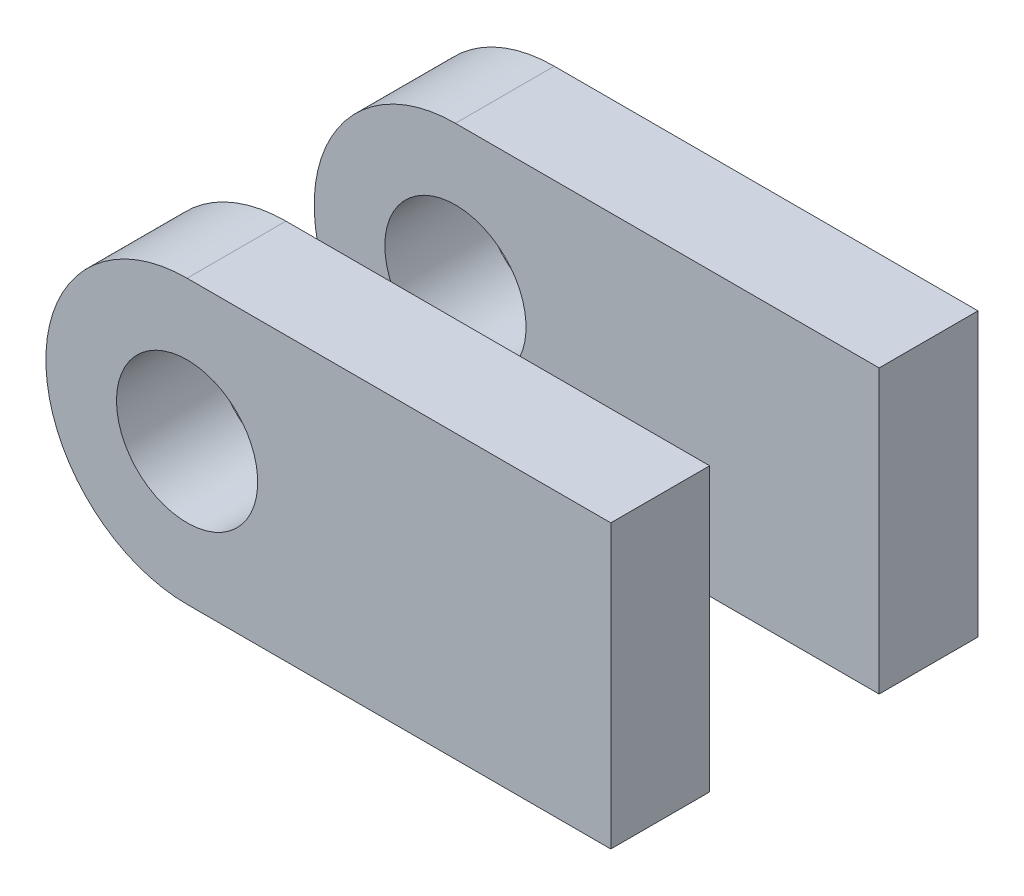
ISO-10303-21;
HEADER;
FILE_DESCRIPTION(('STEP AP214'),'2;1');
FILE_NAME('part.step','',(''),(''),'','','');
FILE_SCHEMA(('AUTOMOTIVE_DESIGN { 1 0 10303 214 1 1 1 1 }'));
ENDSEC;
DATA;
#1=APPLICATION_CONTEXT('core data for automotive mechanical design processes');
#2=APPLICATION_PROTOCOL_DEFINITION('international standard','automotive_design',2000,#1);
#3=PRODUCT_CONTEXT('',#1,'mechanical');
#4=PRODUCT('Part','Part','',(#3));
#5=PRODUCT_RELATED_PRODUCT_CATEGORY('part','',(#4));
#6=PRODUCT_DEFINITION_FORMATION('','',#4);
#7=PRODUCT_DEFINITION_CONTEXT('part definition',#1,'design');
#8=PRODUCT_DEFINITION('design','',#6,#7);
#9=PRODUCT_DEFINITION_SHAPE('','',#8);
#10=(LENGTH_UNIT() NAMED_UNIT(*) SI_UNIT(.MILLI.,.METRE.));
#11=(NAMED_UNIT(*) PLANE_ANGLE_UNIT() SI_UNIT($,.RADIAN.));
#12=(NAMED_UNIT(*) SI_UNIT($,.STERADIAN.) SOLID_ANGLE_UNIT());
#13=UNCERTAINTY_MEASURE_WITH_UNIT(LENGTH_MEASURE(1.E-05),#10,'distance_accuracy_value','');
#14=(GEOMETRIC_REPRESENTATION_CONTEXT(3) GLOBAL_UNCERTAINTY_ASSIGNED_CONTEXT((#13)) GLOBAL_UNIT_ASSIGNED_CONTEXT((#10,
#11,#12)) REPRESENTATION_CONTEXT('',''));
#15=CARTESIAN_POINT('',(0.,0.,0.));
#16=DIRECTION('',(0.,0.,1.));
#17=DIRECTION('',(1.,0.,0.));
#18=AXIS2_PLACEMENT_3D('',#15,#16,#17);
#19=CARTESIAN_POINT('',(0.,20.,0.));
#20=DIRECTION('',(0.,1.,0.));
#21=DIRECTION('',(0.,0.,1.));
#22=AXIS2_PLACEMENT_3D('',#19,#20,#21);
#23=PLANE('',#22);
#24=DIRECTION('',(-1.,0.,0.));
#25=VECTOR('',#24,1.);
#26=CARTESIAN_POINT('',(40.,20.,6.));
#27=LINE('',#26,#25);
#28=CARTESIAN_POINT('',(40.,20.,6.));
#29=VERTEX_POINT('',#28);
#30=CARTESIAN_POINT('',(9.99999999999999,20.,6.));
#31=VERTEX_POINT('',#30);
#32=EDGE_CURVE('E102',#29,#31,#27,.T.);
#33=ORIENTED_EDGE('',*,*,#32,.T.);
#34=DIRECTION('',(0.,0.,-1.));
#35=VECTOR('',#34,1.);
#36=CARTESIAN_POINT('',(9.99999999999999,20.,13.));
#37=LINE('',#36,#35);
#38=CARTESIAN_POINT('',(9.99999999999999,20.,13.));
#39=VERTEX_POINT('',#38);
#40=EDGE_CURVE('E121',#39,#31,#37,.T.);
#41=ORIENTED_EDGE('',*,*,#40,.F.);
#42=DIRECTION('',(1.,0.,0.));
#43=VECTOR('',#42,1.);
#44=CARTESIAN_POINT('',(0.,20.,13.));
#45=LINE('',#44,#43);
#46=CARTESIAN_POINT('',(40.,20.,13.));
#47=VERTEX_POINT('',#46);
#48=EDGE_CURVE('E108',#39,#47,#45,.T.);
#49=ORIENTED_EDGE('',*,*,#48,.T.);
#50=DIRECTION('',(0.,0.,-1.));
#51=VECTOR('',#50,1.);
#52=CARTESIAN_POINT('',(40.,20.,13.));
#53=LINE('',#52,#51);
#54=EDGE_CURVE('E75',#47,#29,#53,.T.);
#55=ORIENTED_EDGE('',*,*,#54,.T.);
#56=EDGE_LOOP('',(#33,#41,#49,#55));
#57=FACE_BOUND('',#56,.T.);
#58=ADVANCED_FACE('F49',(#57),#23,.T.);
#59=CARTESIAN_POINT('',(0.,0.,0.));
#60=DIRECTION('',(0.,1.,0.));
#61=DIRECTION('',(0.,0.,1.));
#62=AXIS2_PLACEMENT_3D('',#59,#60,#61);
#63=PLANE('',#62);
#64=DIRECTION('',(0.,0.,-1.));
#65=VECTOR('',#64,1.);
#66=CARTESIAN_POINT('',(10.,0.,13.));
#67=LINE('',#66,#65);
#68=CARTESIAN_POINT('',(10.,0.,13.));
#69=VERTEX_POINT('',#68);
#70=CARTESIAN_POINT('',(10.,0.,6.));
#71=VERTEX_POINT('',#70);
#72=EDGE_CURVE('E106',#69,#71,#67,.T.);
#73=ORIENTED_EDGE('',*,*,#72,.T.);
#74=DIRECTION('',(-1.,0.,0.));
#75=VECTOR('',#74,1.);
#76=CARTESIAN_POINT('',(40.,0.,6.));
#77=LINE('',#76,#75);
#78=CARTESIAN_POINT('',(40.,0.,6.));
#79=VERTEX_POINT('',#78);
#80=EDGE_CURVE('E96',#79,#71,#77,.T.);
#81=ORIENTED_EDGE('',*,*,#80,.F.);
#82=DIRECTION('',(0.,0.,-1.));
#83=VECTOR('',#82,1.);
#84=CARTESIAN_POINT('',(40.,0.,13.));
#85=LINE('',#84,#83);
#86=CARTESIAN_POINT('',(40.,0.,13.));
#87=VERTEX_POINT('',#86);
#88=EDGE_CURVE('E87',#87,#79,#85,.T.);
#89=ORIENTED_EDGE('',*,*,#88,.F.);
#90=DIRECTION('',(1.,0.,0.));
#91=VECTOR('',#90,1.);
#92=CARTESIAN_POINT('',(0.,0.,13.));
#93=LINE('',#92,#91);
#94=EDGE_CURVE('E97',#69,#87,#93,.T.);
#95=ORIENTED_EDGE('',*,*,#94,.F.);
#96=EDGE_LOOP('',(#73,#81,#89,#95));
#97=FACE_BOUND('',#96,.T.);
#98=ADVANCED_FACE('F105',(#97),#63,.F.);
#99=CARTESIAN_POINT('',(0.,20.,13.));
#100=DIRECTION('',(0.,0.,-1.));
#101=DIRECTION('',(-1.,0.,0.));
#102=AXIS2_PLACEMENT_3D('',#99,#100,#101);
#103=PLANE('',#102);
#104=CARTESIAN_POINT('',(10.,10.,13.));
#105=DIRECTION('',(0.,0.,-1.));
#106=DIRECTION('',(-1.,0.,0.));
#107=AXIS2_PLACEMENT_3D('',#104,#105,#106);
#108=CIRCLE('',#107,5.);
#109=CARTESIAN_POINT('',(5.,10.,13.));
#110=VERTEX_POINT('',#109);
#111=EDGE_CURVE('E130',#110,#110,#108,.T.);
#112=ORIENTED_EDGE('',*,*,#111,.T.);
#113=EDGE_LOOP('',(#112));
#114=FACE_BOUND('',#113,.T.);
#115=ORIENTED_EDGE('',*,*,#48,.F.);
#116=CARTESIAN_POINT('',(10.,10.,13.));
#117=DIRECTION('',(0.,0.,1.));
#118=DIRECTION('',(1.,0.,0.));
#119=AXIS2_PLACEMENT_3D('',#116,#117,#118);
#120=CIRCLE('',#119,10.);
#121=EDGE_CURVE('E124',#39,#69,#120,.T.);
#122=ORIENTED_EDGE('',*,*,#121,.T.);
#123=ORIENTED_EDGE('',*,*,#94,.T.);
#124=DIRECTION('',(0.,-1.,0.));
#125=VECTOR('',#124,1.);
#126=CARTESIAN_POINT('',(40.,20.,13.));
#127=LINE('',#126,#125);
#128=EDGE_CURVE('E12',#47,#87,#127,.T.);
#129=ORIENTED_EDGE('',*,*,#128,.F.);
#130=EDGE_LOOP('',(#115,#122,#123,#129));
#131=FACE_BOUND('',#130,.T.);
#132=ADVANCED_FACE('F51',(#114,#131),#103,.F.);
#133=CARTESIAN_POINT('',(40.,20.,13.));
#134=DIRECTION('',(-1.,0.,0.));
#135=DIRECTION('',(0.,0.,1.));
#136=AXIS2_PLACEMENT_3D('',#133,#134,#135);
#137=PLANE('',#136);
#138=ORIENTED_EDGE('',*,*,#88,.T.);
#139=DIRECTION('',(0.,-1.,0.));
#140=VECTOR('',#139,1.);
#141=CARTESIAN_POINT('',(40.,20.,6.));
#142=LINE('',#141,#140);
#143=EDGE_CURVE('E59',#29,#79,#142,.T.);
#144=ORIENTED_EDGE('',*,*,#143,.F.);
#145=ORIENTED_EDGE('',*,*,#54,.F.);
#146=ORIENTED_EDGE('',*,*,#128,.T.);
#147=EDGE_LOOP('',(#138,#144,#145,#146));
#148=FACE_BOUND('',#147,.T.);
#149=ADVANCED_FACE('F89',(#148),#137,.F.);
#150=CARTESIAN_POINT('',(40.,20.,6.));
#151=DIRECTION('',(0.,0.,1.));
#152=DIRECTION('',(1.,0.,0.));
#153=AXIS2_PLACEMENT_3D('',#150,#151,#152);
#154=PLANE('',#153);
#155=CARTESIAN_POINT('',(10.,10.,6.));
#156=DIRECTION('',(0.,0.,1.));
#157=DIRECTION('',(1.,0.,0.));
#158=AXIS2_PLACEMENT_3D('',#155,#156,#157);
#159=CIRCLE('',#158,5.);
#160=CARTESIAN_POINT('',(15.,10.,6.));
#161=VERTEX_POINT('',#160);
#162=EDGE_CURVE('E53',#161,#161,#159,.T.);
#163=ORIENTED_EDGE('',*,*,#162,.T.);
#164=EDGE_LOOP('',(#163));
#165=FACE_BOUND('',#164,.T.);
#166=ORIENTED_EDGE('',*,*,#80,.T.);
#167=CARTESIAN_POINT('',(10.,10.,6.));
#168=DIRECTION('',(0.,0.,1.));
#169=DIRECTION('',(1.,0.,0.));
#170=AXIS2_PLACEMENT_3D('',#167,#168,#169);
#171=CIRCLE('',#170,10.);
#172=EDGE_CURVE('E66',#71,#31,#171,.F.);
#173=ORIENTED_EDGE('',*,*,#172,.T.);
#174=ORIENTED_EDGE('',*,*,#32,.F.);
#175=ORIENTED_EDGE('',*,*,#143,.T.);
#176=EDGE_LOOP('',(#166,#173,#174,#175));
#177=FACE_BOUND('',#176,.T.);
#178=ADVANCED_FACE('F101',(#165,#177),#154,.F.);
#179=CARTESIAN_POINT('',(10.,10.,13.));
#180=DIRECTION('',(0.,0.,-1.));
#181=DIRECTION('',(-1.,0.,0.));
#182=AXIS2_PLACEMENT_3D('',#179,#180,#181);
#183=CYLINDRICAL_SURFACE('',#182,10.);
#184=ORIENTED_EDGE('',*,*,#172,.F.);
#185=ORIENTED_EDGE('',*,*,#72,.F.);
#186=ORIENTED_EDGE('',*,*,#121,.F.);
#187=ORIENTED_EDGE('',*,*,#40,.T.);
#188=EDGE_LOOP('',(#184,#185,#186,#187));
#189=FACE_BOUND('',#188,.T.);
#190=ADVANCED_FACE('F142',(#189),#183,.T.);
#191=CARTESIAN_POINT('',(10.,10.,13.));
#192=DIRECTION('',(0.,0.,-1.));
#193=DIRECTION('',(-1.,0.,0.));
#194=AXIS2_PLACEMENT_3D('',#191,#192,#193);
#195=CYLINDRICAL_SURFACE('',#194,5.);
#196=ORIENTED_EDGE('',*,*,#111,.F.);
#197=EDGE_LOOP('',(#196));
#198=FACE_BOUND('',#197,.T.);
#199=ORIENTED_EDGE('',*,*,#162,.F.);
#200=EDGE_LOOP('',(#199));
#201=FACE_BOUND('',#200,.T.);
#202=ADVANCED_FACE('F140',(#198,#201),#195,.F.);
#203=CLOSED_SHELL('',(#58,#98,#132,#149,#178,#190,#202));
#204=MANIFOLD_SOLID_BREP('B2',#203);
#205=CARTESIAN_POINT('',(0.,20.,0.));
#206=DIRECTION('',(0.,1.,0.));
#207=DIRECTION('',(0.,0.,1.));
#208=AXIS2_PLACEMENT_3D('',#205,#206,#207);
#209=PLANE('',#208);
#210=DIRECTION('',(-1.,0.,0.));
#211=VECTOR('',#210,1.);
#212=CARTESIAN_POINT('',(40.,20.,-13.));
#213=LINE('',#212,#211);
#214=CARTESIAN_POINT('',(40.,20.,-13.));
#215=VERTEX_POINT('',#214);
#216=CARTESIAN_POINT('',(9.99999999999999,20.,-13.));
#217=VERTEX_POINT('',#216);
#218=EDGE_CURVE('E259',#215,#217,#213,.T.);
#219=ORIENTED_EDGE('',*,*,#218,.T.);
#220=DIRECTION('',(0.,0.,-1.));
#221=VECTOR('',#220,1.);
#222=CARTESIAN_POINT('',(9.99999999999999,20.,13.));
#223=LINE('',#222,#221);
#224=CARTESIAN_POINT('',(9.99999999999999,20.,-6.));
#225=VERTEX_POINT('',#224);
#226=EDGE_CURVE('E272',#225,#217,#223,.T.);
#227=ORIENTED_EDGE('',*,*,#226,.F.);
#228=DIRECTION('',(1.,0.,0.));
#229=VECTOR('',#228,1.);
#230=CARTESIAN_POINT('',(0.,20.,-6.));
#231=LINE('',#230,#229);
#232=CARTESIAN_POINT('',(40.,20.,-6.));
#233=VERTEX_POINT('',#232);
#234=EDGE_CURVE('E262',#225,#233,#231,.T.);
#235=ORIENTED_EDGE('',*,*,#234,.T.);
#236=DIRECTION('',(0.,0.,-1.));
#237=VECTOR('',#236,1.);
#238=CARTESIAN_POINT('',(40.,20.,-6.));
#239=LINE('',#238,#237);
#240=EDGE_CURVE('E231',#233,#215,#239,.T.);
#241=ORIENTED_EDGE('',*,*,#240,.T.);
#242=EDGE_LOOP('',(#219,#227,#235,#241));
#243=FACE_BOUND('',#242,.T.);
#244=ADVANCED_FACE('F208',(#243),#209,.T.);
#245=CARTESIAN_POINT('',(0.,0.,0.));
#246=DIRECTION('',(0.,1.,0.));
#247=DIRECTION('',(0.,0.,1.));
#248=AXIS2_PLACEMENT_3D('',#245,#246,#247);
#249=PLANE('',#248);
#250=DIRECTION('',(0.,0.,-1.));
#251=VECTOR('',#250,1.);
#252=CARTESIAN_POINT('',(10.,0.,13.));
#253=LINE('',#252,#251);
#254=CARTESIAN_POINT('',(9.99999999999999,0.,-13.));
#255=VERTEX_POINT('',#254);
#256=CARTESIAN_POINT('',(10.,0.,-6.));
#257=VERTEX_POINT('',#256);
#258=EDGE_CURVE('E47',#255,#257,#253,.F.);
#259=ORIENTED_EDGE('',*,*,#258,.F.);
#260=DIRECTION('',(-1.,0.,0.));
#261=VECTOR('',#260,1.);
#262=CARTESIAN_POINT('',(40.,0.,-13.));
#263=LINE('',#262,#261);
#264=CARTESIAN_POINT('',(40.,0.,-13.));
#265=VERTEX_POINT('',#264);
#266=EDGE_CURVE('E253',#265,#255,#263,.T.);
#267=ORIENTED_EDGE('',*,*,#266,.F.);
#268=DIRECTION('',(0.,0.,-1.));
#269=VECTOR('',#268,1.);
#270=CARTESIAN_POINT('',(40.,0.,-6.));
#271=LINE('',#270,#269);
#272=CARTESIAN_POINT('',(40.,0.,-6.));
#273=VERTEX_POINT('',#272);
#274=EDGE_CURVE('E244',#273,#265,#271,.T.);
#275=ORIENTED_EDGE('',*,*,#274,.F.);
#276=DIRECTION('',(1.,0.,0.));
#277=VECTOR('',#276,1.);
#278=CARTESIAN_POINT('',(0.,0.,-6.));
#279=LINE('',#278,#277);
#280=EDGE_CURVE('E254',#257,#273,#279,.T.);
#281=ORIENTED_EDGE('',*,*,#280,.F.);
#282=EDGE_LOOP('',(#259,#267,#275,#281));
#283=FACE_BOUND('',#282,.T.);
#284=ADVANCED_FACE('F261',(#283),#249,.F.);
#285=CARTESIAN_POINT('',(0.,20.,-6.));
#286=DIRECTION('',(0.,0.,-1.));
#287=DIRECTION('',(-1.,0.,0.));
#288=AXIS2_PLACEMENT_3D('',#285,#286,#287);
#289=PLANE('',#288);
#290=CARTESIAN_POINT('',(10.,10.,-6.));
#291=DIRECTION('',(0.,0.,-1.));
#292=DIRECTION('',(-1.,0.,0.));
#293=AXIS2_PLACEMENT_3D('',#290,#291,#292);
#294=CIRCLE('',#293,5.);
#295=CARTESIAN_POINT('',(5.,10.,-6.));
#296=VERTEX_POINT('',#295);
#297=EDGE_CURVE('E275',#296,#296,#294,.T.);
#298=ORIENTED_EDGE('',*,*,#297,.T.);
#299=EDGE_LOOP('',(#298));
#300=FACE_BOUND('',#299,.T.);
#301=ORIENTED_EDGE('',*,*,#234,.F.);
#302=CARTESIAN_POINT('',(10.,10.,-6.));
#303=DIRECTION('',(0.,0.,-1.));
#304=DIRECTION('',(-1.,0.,0.));
#305=AXIS2_PLACEMENT_3D('',#302,#303,#304);
#306=CIRCLE('',#305,10.);
#307=EDGE_CURVE('E267',#225,#257,#306,.F.);
#308=ORIENTED_EDGE('',*,*,#307,.T.);
#309=ORIENTED_EDGE('',*,*,#280,.T.);
#310=DIRECTION('',(0.,-1.,0.));
#311=VECTOR('',#310,1.);
#312=CARTESIAN_POINT('',(40.,20.,-6.));
#313=LINE('',#312,#311);
#314=EDGE_CURVE('E216',#233,#273,#313,.T.);
#315=ORIENTED_EDGE('',*,*,#314,.F.);
#316=EDGE_LOOP('',(#301,#308,#309,#315));
#317=FACE_BOUND('',#316,.T.);
#318=ADVANCED_FACE('F210',(#300,#317),#289,.F.);
#319=CARTESIAN_POINT('',(40.,20.,-6.));
#320=DIRECTION('',(-1.,0.,0.));
#321=DIRECTION('',(0.,0.,1.));
#322=AXIS2_PLACEMENT_3D('',#319,#320,#321);
#323=PLANE('',#322);
#324=ORIENTED_EDGE('',*,*,#274,.T.);
#325=DIRECTION('',(0.,-1.,0.));
#326=VECTOR('',#325,1.);
#327=CARTESIAN_POINT('',(40.,20.,-13.));
#328=LINE('',#327,#326);
#329=EDGE_CURVE('E247',#215,#265,#328,.T.);
#330=ORIENTED_EDGE('',*,*,#329,.F.);
#331=ORIENTED_EDGE('',*,*,#240,.F.);
#332=ORIENTED_EDGE('',*,*,#314,.T.);
#333=EDGE_LOOP('',(#324,#330,#331,#332));
#334=FACE_BOUND('',#333,.T.);
#335=ADVANCED_FACE('F246',(#334),#323,.F.);
#336=CARTESIAN_POINT('',(40.,20.,-13.));
#337=DIRECTION('',(0.,0.,1.));
#338=DIRECTION('',(1.,0.,0.));
#339=AXIS2_PLACEMENT_3D('',#336,#337,#338);
#340=PLANE('',#339);
#341=CARTESIAN_POINT('',(10.,10.,-13.));
#342=DIRECTION('',(0.,0.,-1.));
#343=DIRECTION('',(-1.,0.,0.));
#344=AXIS2_PLACEMENT_3D('',#341,#342,#343);
#345=CIRCLE('',#344,5.);
#346=CARTESIAN_POINT('',(5.,10.,-13.));
#347=VERTEX_POINT('',#346);
#348=EDGE_CURVE('E278',#347,#347,#345,.T.);
#349=ORIENTED_EDGE('',*,*,#348,.F.);
#350=EDGE_LOOP('',(#349));
#351=FACE_BOUND('',#350,.T.);
#352=ORIENTED_EDGE('',*,*,#266,.T.);
#353=CARTESIAN_POINT('',(10.,10.,-13.));
#354=DIRECTION('',(0.,0.,1.));
#355=DIRECTION('',(1.,0.,0.));
#356=AXIS2_PLACEMENT_3D('',#353,#354,#355);
#357=CIRCLE('',#356,10.);
#358=EDGE_CURVE('E222',#217,#255,#357,.T.);
#359=ORIENTED_EDGE('',*,*,#358,.F.);
#360=ORIENTED_EDGE('',*,*,#218,.F.);
#361=ORIENTED_EDGE('',*,*,#329,.T.);
#362=EDGE_LOOP('',(#352,#359,#360,#361));
#363=FACE_BOUND('',#362,.T.);
#364=ADVANCED_FACE('F258',(#351,#363),#340,.F.);
#365=CARTESIAN_POINT('',(10.,10.,13.));
#366=DIRECTION('',(0.,0.,-1.));
#367=DIRECTION('',(-1.,0.,0.));
#368=AXIS2_PLACEMENT_3D('',#365,#366,#367);
#369=CYLINDRICAL_SURFACE('',#368,10.);
#370=ORIENTED_EDGE('',*,*,#358,.T.);
#371=ORIENTED_EDGE('',*,*,#258,.T.);
#372=ORIENTED_EDGE('',*,*,#307,.F.);
#373=ORIENTED_EDGE('',*,*,#226,.T.);
#374=EDGE_LOOP('',(#370,#371,#372,#373));
#375=FACE_BOUND('',#374,.T.);
#376=ADVANCED_FACE('F286',(#375),#369,.T.);
#377=CARTESIAN_POINT('',(10.,10.,13.));
#378=DIRECTION('',(0.,0.,-1.));
#379=DIRECTION('',(-1.,0.,0.));
#380=AXIS2_PLACEMENT_3D('',#377,#378,#379);
#381=CYLINDRICAL_SURFACE('',#380,5.);
#382=ORIENTED_EDGE('',*,*,#348,.T.);
#383=EDGE_LOOP('',(#382));
#384=FACE_BOUND('',#383,.T.);
#385=ORIENTED_EDGE('',*,*,#297,.F.);
#386=EDGE_LOOP('',(#385));
#387=FACE_BOUND('',#386,.T.);
#388=ADVANCED_FACE('F282',(#384,#387),#381,.F.);
#389=CLOSED_SHELL('',(#244,#284,#318,#335,#364,#376,#388));
#390=MANIFOLD_SOLID_BREP('B6',#389);
#391=ADVANCED_BREP_SHAPE_REPRESENTATION('',(#18,#204,#390),#14);
#392=SHAPE_DEFINITION_REPRESENTATION(#9,#391);
ENDSEC;
END-ISO-10303-21;
